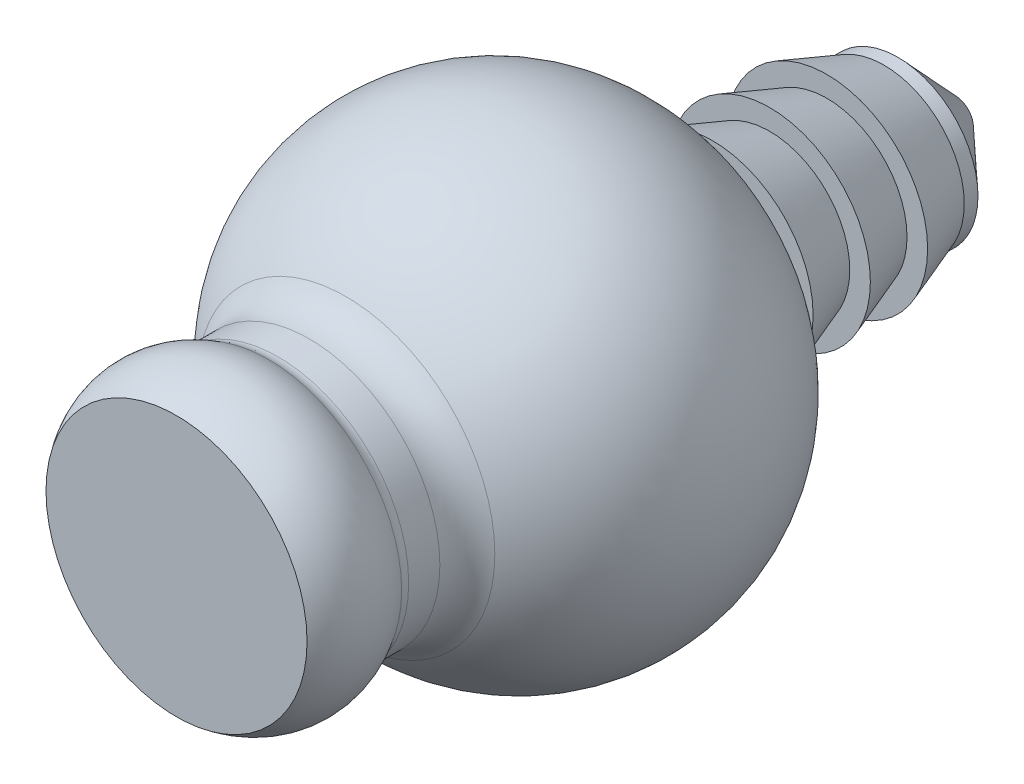
ISO-10303-21;
HEADER;
FILE_DESCRIPTION(('STEP AP214'),'2;1');
FILE_NAME('part.step','',(''),(''),'','','');
FILE_SCHEMA(('AUTOMOTIVE_DESIGN { 1 0 10303 214 1 1 1 1 }'));
ENDSEC;
DATA;
#1=APPLICATION_CONTEXT('core data for automotive mechanical design processes');
#2=APPLICATION_PROTOCOL_DEFINITION('international standard','automotive_design',2000,#1);
#3=PRODUCT_CONTEXT('',#1,'mechanical');
#4=PRODUCT('Part','Part','',(#3));
#5=PRODUCT_RELATED_PRODUCT_CATEGORY('part','',(#4));
#6=PRODUCT_DEFINITION_FORMATION('','',#4);
#7=PRODUCT_DEFINITION_CONTEXT('part definition',#1,'design');
#8=PRODUCT_DEFINITION('design','',#6,#7);
#9=PRODUCT_DEFINITION_SHAPE('','',#8);
#10=(LENGTH_UNIT() NAMED_UNIT(*) SI_UNIT(.MILLI.,.METRE.));
#11=(NAMED_UNIT(*) PLANE_ANGLE_UNIT() SI_UNIT($,.RADIAN.));
#12=(NAMED_UNIT(*) SI_UNIT($,.STERADIAN.) SOLID_ANGLE_UNIT());
#13=UNCERTAINTY_MEASURE_WITH_UNIT(LENGTH_MEASURE(1.E-05),#10,'distance_accuracy_value','');
#14=(GEOMETRIC_REPRESENTATION_CONTEXT(3) GLOBAL_UNCERTAINTY_ASSIGNED_CONTEXT((#13)) GLOBAL_UNIT_ASSIGNED_CONTEXT((#10,
#11,#12)) REPRESENTATION_CONTEXT('',''));
#15=CARTESIAN_POINT('',(0.,0.,0.));
#16=DIRECTION('',(0.,0.,1.));
#17=DIRECTION('',(1.,0.,0.));
#18=AXIS2_PLACEMENT_3D('',#15,#16,#17);
#19=CARTESIAN_POINT('',(-2.85,0.,10.7));
#20=DIRECTION('',(0.,0.,-1.));
#21=DIRECTION('',(-1.,0.,0.));
#22=AXIS2_PLACEMENT_3D('',#19,#20,#21);
#23=PLANE('',#22);
#24=CARTESIAN_POINT('',(0.,0.,10.7));
#25=DIRECTION('',(0.,0.,1.));
#26=DIRECTION('',(1.,0.,0.));
#27=AXIS2_PLACEMENT_3D('',#24,#25,#26);
#28=CIRCLE('',#27,2.85);
#29=CARTESIAN_POINT('',(2.85,0.,10.7));
#30=VERTEX_POINT('',#29);
#31=EDGE_CURVE('E84',#30,#30,#28,.T.);
#32=ORIENTED_EDGE('',*,*,#31,.T.);
#33=EDGE_LOOP('',(#32));
#34=FACE_BOUND('',#33,.T.);
#35=ADVANCED_FACE('F32',(#34),#23,.F.);
#36=CARTESIAN_POINT('',(0.,0.,-6.3));
#37=DIRECTION('',(0.,0.,1.));
#38=DIRECTION('',(1.,0.,0.));
#39=AXIS2_PLACEMENT_3D('',#36,#37,#38);
#40=PLANE('',#39);
#41=CARTESIAN_POINT('',(0.,0.,-6.3));
#42=DIRECTION('',(0.,0.,1.));
#43=DIRECTION('',(1.,0.,0.));
#44=AXIS2_PLACEMENT_3D('',#41,#42,#43);
#45=CIRCLE('',#44,0.4);
#46=CARTESIAN_POINT('',(0.4,0.,-6.3));
#47=VERTEX_POINT('',#46);
#48=EDGE_CURVE('E10',#47,#47,#45,.T.);
#49=ORIENTED_EDGE('',*,*,#48,.F.);
#50=EDGE_LOOP('',(#49));
#51=FACE_BOUND('',#50,.T.);
#52=ADVANCED_FACE('F174',(#51),#40,.F.);
#53=CARTESIAN_POINT('',(0.,0.,-6.3));
#54=DIRECTION('',(0.,0.,1.));
#55=DIRECTION('',(1.,0.,0.));
#56=AXIS2_PLACEMENT_3D('',#53,#54,#55);
#57=CONICAL_SURFACE('',#56,0.4,0.823840753418636);
#58=CARTESIAN_POINT('',(0.,0.,-5.05));
#59=DIRECTION('',(0.,0.,1.));
#60=DIRECTION('',(1.,0.,0.));
#61=AXIS2_PLACEMENT_3D('',#58,#59,#60);
#62=CIRCLE('',#61,1.75);
#63=CARTESIAN_POINT('',(1.75,0.,-5.05));
#64=VERTEX_POINT('',#63);
#65=EDGE_CURVE('E38',#64,#64,#62,.T.);
#66=CARTESIAN_POINT('',(1.75,0.,-5.05));
#67=CARTESIAN_POINT('',(1.7359375,0.,-5.06302083333333));
#68=CARTESIAN_POINT('',(1.721875,0.,-5.07604166666667));
#69=CARTESIAN_POINT('',(1.69375,0.,-5.10208333333333));
#70=CARTESIAN_POINT('',(1.6796875,0.,-5.11510416666667));
#71=CARTESIAN_POINT('',(1.6515625,0.,-5.14114583333333));
#72=CARTESIAN_POINT('',(1.6375,0.,-5.15416666666667));
#73=CARTESIAN_POINT('',(1.609375,0.,-5.18020833333333));
#74=CARTESIAN_POINT('',(1.5953125,0.,-5.19322916666667));
#75=CARTESIAN_POINT('',(1.5671875,0.,-5.21927083333333));
#76=CARTESIAN_POINT('',(1.553125,0.,-5.23229166666667));
#77=CARTESIAN_POINT('',(1.525,0.,-5.25833333333333));
#78=CARTESIAN_POINT('',(1.5109375,0.,-5.27135416666667));
#79=CARTESIAN_POINT('',(1.4828125,0.,-5.29739583333333));
#80=CARTESIAN_POINT('',(1.46875,0.,-5.31041666666667));
#81=CARTESIAN_POINT('',(1.440625,0.,-5.33645833333333));
#82=CARTESIAN_POINT('',(1.4265625,0.,-5.34947916666667));
#83=CARTESIAN_POINT('',(1.3984375,0.,-5.37552083333333));
#84=CARTESIAN_POINT('',(1.384375,0.,-5.38854166666667));
#85=CARTESIAN_POINT('',(1.35625,0.,-5.41458333333333));
#86=CARTESIAN_POINT('',(1.3421875,0.,-5.42760416666667));
#87=CARTESIAN_POINT('',(1.3140625,0.,-5.45364583333333));
#88=CARTESIAN_POINT('',(1.3,0.,-5.46666666666667));
#89=CARTESIAN_POINT('',(1.271875,0.,-5.49270833333333));
#90=CARTESIAN_POINT('',(1.2578125,0.,-5.50572916666667));
#91=CARTESIAN_POINT('',(1.2296875,0.,-5.53177083333333));
#92=CARTESIAN_POINT('',(1.215625,0.,-5.54479166666667));
#93=CARTESIAN_POINT('',(1.1875,0.,-5.57083333333333));
#94=CARTESIAN_POINT('',(1.1734375,0.,-5.58385416666667));
#95=CARTESIAN_POINT('',(1.1453125,0.,-5.60989583333333));
#96=CARTESIAN_POINT('',(1.13125,0.,-5.62291666666667));
#97=CARTESIAN_POINT('',(1.103125,0.,-5.64895833333333));
#98=CARTESIAN_POINT('',(1.0890625,0.,-5.66197916666667));
#99=CARTESIAN_POINT('',(1.0609375,0.,-5.68802083333333));
#100=CARTESIAN_POINT('',(1.046875,0.,-5.70104166666667));
#101=CARTESIAN_POINT('',(1.01875,0.,-5.72708333333333));
#102=CARTESIAN_POINT('',(1.0046875,0.,-5.74010416666667));
#103=CARTESIAN_POINT('',(0.9765625,0.,-5.76614583333333));
#104=CARTESIAN_POINT('',(0.9625,0.,-5.77916666666667));
#105=CARTESIAN_POINT('',(0.934375,0.,-5.80520833333333));
#106=CARTESIAN_POINT('',(0.9203125,0.,-5.81822916666667));
#107=CARTESIAN_POINT('',(0.8921875,0.,-5.84427083333333));
#108=CARTESIAN_POINT('',(0.878125,0.,-5.85729166666667));
#109=CARTESIAN_POINT('',(0.85,0.,-5.88333333333333));
#110=CARTESIAN_POINT('',(0.8359375,0.,-5.89635416666667));
#111=CARTESIAN_POINT('',(0.8078125,0.,-5.92239583333333));
#112=CARTESIAN_POINT('',(0.79375,0.,-5.93541666666667));
#113=CARTESIAN_POINT('',(0.765625,0.,-5.96145833333333));
#114=CARTESIAN_POINT('',(0.7515625,0.,-5.97447916666667));
#115=CARTESIAN_POINT('',(0.7234375,0.,-6.00052083333333));
#116=CARTESIAN_POINT('',(0.709375,0.,-6.01354166666667));
#117=CARTESIAN_POINT('',(0.68125,0.,-6.03958333333333));
#118=CARTESIAN_POINT('',(0.6671875,0.,-6.05260416666667));
#119=CARTESIAN_POINT('',(0.6390625,0.,-6.07864583333333));
#120=CARTESIAN_POINT('',(0.625,0.,-6.09166666666667));
#121=CARTESIAN_POINT('',(0.596874999999999,0.,-6.11770833333333));
#122=CARTESIAN_POINT('',(0.582812499999999,0.,-6.13072916666667));
#123=CARTESIAN_POINT('',(0.5546875,0.,-6.15677083333333));
#124=CARTESIAN_POINT('',(0.540625,0.,-6.16979166666667));
#125=CARTESIAN_POINT('',(0.5125,0.,-6.19583333333333));
#126=CARTESIAN_POINT('',(0.4984375,0.,-6.20885416666667));
#127=CARTESIAN_POINT('',(0.470312499999999,0.,-6.23489583333333));
#128=CARTESIAN_POINT('',(0.45625,0.,-6.24791666666667));
#129=CARTESIAN_POINT('',(0.428125,0.,-6.27395833333333));
#130=CARTESIAN_POINT('',(0.4140625,0.,-6.28697916666667));
#131=CARTESIAN_POINT('',(0.4,0.,-6.3));
#132=B_SPLINE_CURVE_WITH_KNOTS('',3,(#66,#67,#68,#69,#70,#71,#72,#73,#74,#75,#76,#77,#78,#79,
#80,#81,#82,#83,#84,#85,#86,#87,#88,#89,#90,#91,#92,#93,#94,#95,#96,#97,#98,#99,#100,#101,#102,
#103,#104,#105,#106,#107,#108,#109,#110,#111,#112,#113,#114,#115,#116,#117,#118,#119,#120,#121,
#122,#123,#124,#125,#126,#127,#128,#129,#130,#131),.UNSPECIFIED.,.F.,.F.,(4,2,2,2,2,2,2,2,2,2,2,
2,2,2,2,2,2,2,2,2,2,2,2,2,2,2,2,2,2,2,2,2,4),(0.,0.0574949046655434,0.114989809331088,
0.172484713996632,0.229979618662176,0.28747452332772,0.344969427993264,0.402464332658808,
0.459959237324352,0.517454141989896,0.57494904665544,0.632443951320984,0.689938855986528,
0.747433760652072,0.804928665317617,0.862423569983161,0.919918474648705,0.977413379314249,
1.03490828397979,1.09240318864534,1.14989809331088,1.20739299797643,1.26488790264197,
1.32238280730751,1.37987771197306,1.4373726166386,1.49486752130415,1.55236242596969,
1.60985733063523,1.66735223530078,1.72484713996632,1.78234204463187,1.83983694929741),.UNSPECIFIED.);
#133=EDGE_CURVE('BSEAM169',#64,#47,#132,.T.);
#134=ORIENTED_EDGE('',*,*,#65,.F.);
#135=ORIENTED_EDGE('',*,*,#48,.T.);
#136=ORIENTED_EDGE('',*,*,#133,.T.);
#137=ORIENTED_EDGE('',*,*,#133,.F.);
#138=EDGE_LOOP('',(#134,#136,#135,#137));
#139=FACE_BOUND('',#138,.T.);
#140=ADVANCED_FACE('F169',(#139),#57,.T.);
#141=CARTESIAN_POINT('',(0.,0.,-6.3));
#142=DIRECTION('',(0.,0.,1.));
#143=DIRECTION('',(1.,0.,0.));
#144=AXIS2_PLACEMENT_3D('',#141,#142,#143);
#145=CYLINDRICAL_SURFACE('',#144,1.75);
#146=CARTESIAN_POINT('',(0.,0.,-4.75));
#147=DIRECTION('',(0.,0.,1.));
#148=DIRECTION('',(1.,0.,0.));
#149=AXIS2_PLACEMENT_3D('',#146,#147,#148);
#150=CIRCLE('',#149,1.75);
#151=CARTESIAN_POINT('',(1.75,0.,-4.75));
#152=VERTEX_POINT('',#151);
#153=EDGE_CURVE('E42',#152,#152,#150,.T.);
#154=ORIENTED_EDGE('',*,*,#153,.F.);
#155=EDGE_LOOP('',(#154));
#156=FACE_BOUND('',#155,.T.);
#157=ORIENTED_EDGE('',*,*,#65,.T.);
#158=EDGE_LOOP('',(#157));
#159=FACE_BOUND('',#158,.T.);
#160=ADVANCED_FACE('F164',(#156,#159),#145,.T.);
#161=CARTESIAN_POINT('',(0.,0.,-4.75));
#162=DIRECTION('',(0.,0.,1.));
#163=DIRECTION('',(1.,0.,0.));
#164=AXIS2_PLACEMENT_3D('',#161,#162,#163);
#165=CONICAL_SURFACE('',#164,1.75,0.345555580581712);
#166=CARTESIAN_POINT('',(0.,0.,-3.5));
#167=DIRECTION('',(0.,0.,1.));
#168=DIRECTION('',(1.,0.,0.));
#169=AXIS2_PLACEMENT_3D('',#166,#167,#168);
#170=CIRCLE('',#169,2.2);
#171=CARTESIAN_POINT('',(2.2,0.,-3.5));
#172=VERTEX_POINT('',#171);
#173=EDGE_CURVE('E46',#172,#172,#170,.T.);
#174=ORIENTED_EDGE('',*,*,#173,.F.);
#175=EDGE_LOOP('',(#174));
#176=FACE_BOUND('',#175,.T.);
#177=ORIENTED_EDGE('',*,*,#153,.T.);
#178=EDGE_LOOP('',(#177));
#179=FACE_BOUND('',#178,.T.);
#180=ADVANCED_FACE('F158',(#176,#179),#165,.T.);
#181=CARTESIAN_POINT('',(-2.2,0.,-3.5));
#182=DIRECTION('',(0.,0.,-1.));
#183=DIRECTION('',(-1.,0.,0.));
#184=AXIS2_PLACEMENT_3D('',#181,#182,#183);
#185=PLANE('',#184);
#186=CARTESIAN_POINT('',(0.,0.,-3.5));
#187=DIRECTION('',(0.,0.,1.));
#188=DIRECTION('',(1.,0.,0.));
#189=AXIS2_PLACEMENT_3D('',#186,#187,#188);
#190=CIRCLE('',#189,1.75);
#191=CARTESIAN_POINT('',(1.75,0.,-3.5));
#192=VERTEX_POINT('',#191);
#193=EDGE_CURVE('E51',#192,#192,#190,.T.);
#194=ORIENTED_EDGE('',*,*,#193,.F.);
#195=EDGE_LOOP('',(#194));
#196=FACE_BOUND('',#195,.T.);
#197=ORIENTED_EDGE('',*,*,#173,.T.);
#198=EDGE_LOOP('',(#197));
#199=FACE_BOUND('',#198,.T.);
#200=ADVANCED_FACE('F152',(#196,#199),#185,.F.);
#201=CARTESIAN_POINT('',(0.,0.,-3.5));
#202=DIRECTION('',(0.,0.,1.));
#203=DIRECTION('',(1.,0.,0.));
#204=AXIS2_PLACEMENT_3D('',#201,#202,#203);
#205=CONICAL_SURFACE('',#204,1.75,0.345555580581712);
#206=CARTESIAN_POINT('',(0.,0.,-2.25));
#207=DIRECTION('',(0.,0.,1.));
#208=DIRECTION('',(1.,0.,0.));
#209=AXIS2_PLACEMENT_3D('',#206,#207,#208);
#210=CIRCLE('',#209,2.2);
#211=CARTESIAN_POINT('',(2.2,0.,-2.25));
#212=VERTEX_POINT('',#211);
#213=EDGE_CURVE('E54',#212,#212,#210,.T.);
#214=ORIENTED_EDGE('',*,*,#213,.F.);
#215=EDGE_LOOP('',(#214));
#216=FACE_BOUND('',#215,.T.);
#217=ORIENTED_EDGE('',*,*,#193,.T.);
#218=EDGE_LOOP('',(#217));
#219=FACE_BOUND('',#218,.T.);
#220=ADVANCED_FACE('F146',(#216,#219),#205,.T.);
#221=CARTESIAN_POINT('',(-2.2,0.,-2.25));
#222=DIRECTION('',(0.,0.,-1.));
#223=DIRECTION('',(-1.,0.,0.));
#224=AXIS2_PLACEMENT_3D('',#221,#222,#223);
#225=PLANE('',#224);
#226=CARTESIAN_POINT('',(0.,0.,-2.25));
#227=DIRECTION('',(0.,0.,1.));
#228=DIRECTION('',(1.,0.,0.));
#229=AXIS2_PLACEMENT_3D('',#226,#227,#228);
#230=CIRCLE('',#229,1.75);
#231=CARTESIAN_POINT('',(1.75,0.,-2.25));
#232=VERTEX_POINT('',#231);
#233=EDGE_CURVE('E57',#232,#232,#230,.T.);
#234=ORIENTED_EDGE('',*,*,#233,.F.);
#235=EDGE_LOOP('',(#234));
#236=FACE_BOUND('',#235,.T.);
#237=ORIENTED_EDGE('',*,*,#213,.T.);
#238=EDGE_LOOP('',(#237));
#239=FACE_BOUND('',#238,.T.);
#240=ADVANCED_FACE('F140',(#236,#239),#225,.F.);
#241=CARTESIAN_POINT('',(0.,0.,-2.25));
#242=DIRECTION('',(0.,0.,1.));
#243=DIRECTION('',(1.,0.,0.));
#244=AXIS2_PLACEMENT_3D('',#241,#242,#243);
#245=CONICAL_SURFACE('',#244,1.75,0.345555580581712);
#246=CARTESIAN_POINT('',(0.,0.,-1.));
#247=DIRECTION('',(0.,0.,1.));
#248=DIRECTION('',(1.,0.,0.));
#249=AXIS2_PLACEMENT_3D('',#246,#247,#248);
#250=CIRCLE('',#249,2.2);
#251=CARTESIAN_POINT('',(2.2,0.,-1.));
#252=VERTEX_POINT('',#251);
#253=EDGE_CURVE('E60',#252,#252,#250,.T.);
#254=ORIENTED_EDGE('',*,*,#253,.F.);
#255=EDGE_LOOP('',(#254));
#256=FACE_BOUND('',#255,.T.);
#257=ORIENTED_EDGE('',*,*,#233,.T.);
#258=EDGE_LOOP('',(#257));
#259=FACE_BOUND('',#258,.T.);
#260=ADVANCED_FACE('F134',(#256,#259),#245,.T.);
#261=CARTESIAN_POINT('',(-2.2,0.,-1.));
#262=DIRECTION('',(0.,0.,-1.));
#263=DIRECTION('',(-1.,0.,0.));
#264=AXIS2_PLACEMENT_3D('',#261,#262,#263);
#265=PLANE('',#264);
#266=CARTESIAN_POINT('',(0.,0.,-1.));
#267=DIRECTION('',(0.,0.,1.));
#268=DIRECTION('',(1.,0.,0.));
#269=AXIS2_PLACEMENT_3D('',#266,#267,#268);
#270=CIRCLE('',#269,1.75);
#271=CARTESIAN_POINT('',(1.75,0.,-1.));
#272=VERTEX_POINT('',#271);
#273=EDGE_CURVE('E63',#272,#272,#270,.T.);
#274=ORIENTED_EDGE('',*,*,#273,.F.);
#275=EDGE_LOOP('',(#274));
#276=FACE_BOUND('',#275,.T.);
#277=ORIENTED_EDGE('',*,*,#253,.T.);
#278=EDGE_LOOP('',(#277));
#279=FACE_BOUND('',#278,.T.);
#280=ADVANCED_FACE('F128',(#276,#279),#265,.F.);
#281=CARTESIAN_POINT('',(0.,0.,-6.3));
#282=DIRECTION('',(0.,0.,1.));
#283=DIRECTION('',(1.,0.,0.));
#284=AXIS2_PLACEMENT_3D('',#281,#282,#283);
#285=CYLINDRICAL_SURFACE('',#284,1.75);
#286=CARTESIAN_POINT('',(0.,0.,0.));
#287=DIRECTION('',(0.,0.,1.));
#288=DIRECTION('',(1.,0.,0.));
#289=AXIS2_PLACEMENT_3D('',#286,#287,#288);
#290=CIRCLE('',#289,1.75);
#291=CARTESIAN_POINT('',(1.75,0.,0.));
#292=VERTEX_POINT('',#291);
#293=EDGE_CURVE('E66',#292,#292,#290,.T.);
#294=ORIENTED_EDGE('',*,*,#293,.F.);
#295=EDGE_LOOP('',(#294));
#296=FACE_BOUND('',#295,.T.);
#297=ORIENTED_EDGE('',*,*,#273,.T.);
#298=EDGE_LOOP('',(#297));
#299=FACE_BOUND('',#298,.T.);
#300=ADVANCED_FACE('F122',(#296,#299),#285,.T.);
#301=CARTESIAN_POINT('',(-1.75,0.,0.));
#302=DIRECTION('',(0.,0.,1.));
#303=DIRECTION('',(1.,0.,0.));
#304=AXIS2_PLACEMENT_3D('',#301,#302,#303);
#305=PLANE('',#304);
#306=CARTESIAN_POINT('',(0.,0.,0.));
#307=DIRECTION('',(0.,0.,1.));
#308=DIRECTION('',(1.,0.,0.));
#309=AXIS2_PLACEMENT_3D('',#306,#307,#308);
#310=CIRCLE('',#309,3.25);
#311=CARTESIAN_POINT('',(3.25,0.,0.));
#312=VERTEX_POINT('',#311);
#313=EDGE_CURVE('E69',#312,#312,#310,.T.);
#314=ORIENTED_EDGE('',*,*,#313,.F.);
#315=EDGE_LOOP('',(#314));
#316=FACE_BOUND('',#315,.T.);
#317=ORIENTED_EDGE('',*,*,#293,.T.);
#318=EDGE_LOOP('',(#317));
#319=FACE_BOUND('',#318,.T.);
#320=ADVANCED_FACE('F116',(#316,#319),#305,.F.);
#321=CARTESIAN_POINT('',(0.,0.,3.5));
#322=DIRECTION('',(0.,0.,1.));
#323=DIRECTION('',(1.,0.,0.));
#324=AXIS2_PLACEMENT_3D('',#321,#322,#323);
#325=DEGENERATE_TOROIDAL_SURFACE('',#324,0.625,4.375,.T.);
#326=CARTESIAN_POINT('',(0.,0.,7.));
#327=DIRECTION('',(0.,0.,1.));
#328=DIRECTION('',(1.,0.,0.));
#329=AXIS2_PLACEMENT_3D('',#326,#327,#328);
#330=CIRCLE('',#329,3.25);
#331=CARTESIAN_POINT('',(3.25,0.,7.));
#332=VERTEX_POINT('',#331);
#333=EDGE_CURVE('E72',#332,#332,#330,.T.);
#334=ORIENTED_EDGE('',*,*,#333,.F.);
#335=EDGE_LOOP('',(#334));
#336=FACE_BOUND('',#335,.T.);
#337=ORIENTED_EDGE('',*,*,#313,.T.);
#338=EDGE_LOOP('',(#337));
#339=FACE_BOUND('',#338,.T.);
#340=ADVANCED_FACE('F110',(#336,#339),#325,.T.);
#341=CARTESIAN_POINT('',(0.,0.,7.8));
#342=DIRECTION('',(0.,0.,1.));
#343=DIRECTION('',(1.,0.,0.));
#344=AXIS2_PLACEMENT_3D('',#341,#342,#343);
#345=TOROIDAL_SURFACE('',#344,3.85,0.999999999999997);
#346=CARTESIAN_POINT('',(0.,0.,7.8));
#347=DIRECTION('',(0.,0.,1.));
#348=DIRECTION('',(1.,0.,0.));
#349=AXIS2_PLACEMENT_3D('',#346,#347,#348);
#350=CIRCLE('',#349,2.85);
#351=CARTESIAN_POINT('',(2.85,0.,7.8));
#352=VERTEX_POINT('',#351);
#353=EDGE_CURVE('E75',#352,#352,#350,.T.);
#354=ORIENTED_EDGE('',*,*,#353,.F.);
#355=EDGE_LOOP('',(#354));
#356=FACE_BOUND('',#355,.T.);
#357=ORIENTED_EDGE('',*,*,#333,.T.);
#358=EDGE_LOOP('',(#357));
#359=FACE_BOUND('',#358,.T.);
#360=ADVANCED_FACE('F104',(#356,#359),#345,.F.);
#361=CARTESIAN_POINT('',(0.,0.,-6.3));
#362=DIRECTION('',(0.,0.,1.));
#363=DIRECTION('',(1.,0.,0.));
#364=AXIS2_PLACEMENT_3D('',#361,#362,#363);
#365=CYLINDRICAL_SURFACE('',#364,2.85);
#366=CARTESIAN_POINT('',(0.,0.,8.48076396964289));
#367=DIRECTION('',(0.,0.,1.));
#368=DIRECTION('',(1.,0.,0.));
#369=AXIS2_PLACEMENT_3D('',#366,#367,#368);
#370=CIRCLE('',#369,2.85);
#371=CARTESIAN_POINT('',(2.85,0.,8.48076396964289));
#372=VERTEX_POINT('',#371);
#373=EDGE_CURVE('E78',#372,#372,#370,.T.);
#374=ORIENTED_EDGE('',*,*,#373,.F.);
#375=EDGE_LOOP('',(#374));
#376=FACE_BOUND('',#375,.T.);
#377=ORIENTED_EDGE('',*,*,#353,.T.);
#378=EDGE_LOOP('',(#377));
#379=FACE_BOUND('',#378,.T.);
#380=ADVANCED_FACE('F98',(#376,#379),#365,.T.);
#381=CARTESIAN_POINT('',(0.,0.,8.48076396964289));
#382=DIRECTION('',(0.,0.,1.));
#383=DIRECTION('',(1.,0.,0.));
#384=AXIS2_PLACEMENT_3D('',#381,#382,#383);
#385=TOROIDAL_SURFACE('',#384,3.25,0.4);
#386=CARTESIAN_POINT('',(0.,0.,8.7));
#387=DIRECTION('',(0.,0.,1.));
#388=DIRECTION('',(1.,0.,0.));
#389=AXIS2_PLACEMENT_3D('',#386,#387,#388);
#390=CIRCLE('',#389,2.91543227442974);
#391=CARTESIAN_POINT('',(2.91543227442974,0.,8.7));
#392=VERTEX_POINT('',#391);
#393=EDGE_CURVE('E81',#392,#392,#390,.T.);
#394=ORIENTED_EDGE('',*,*,#393,.F.);
#395=EDGE_LOOP('',(#394));
#396=FACE_BOUND('',#395,.T.);
#397=ORIENTED_EDGE('',*,*,#373,.T.);
#398=EDGE_LOOP('',(#397));
#399=FACE_BOUND('',#398,.T.);
#400=ADVANCED_FACE('F92',(#396,#399),#385,.F.);
#401=CARTESIAN_POINT('',(0.,0.,9.65346675727689));
#402=DIRECTION('',(0.,0.,1.));
#403=DIRECTION('',(1.,0.,0.));
#404=AXIS2_PLACEMENT_3D('',#401,#402,#403);
#405=DEGENERATE_TOROIDAL_SURFACE('',#404,1.46038310267922,1.73961689732078,.T.);
#406=ORIENTED_EDGE('',*,*,#31,.F.);
#407=EDGE_LOOP('',(#406));
#408=FACE_BOUND('',#407,.T.);
#409=ORIENTED_EDGE('',*,*,#393,.T.);
#410=EDGE_LOOP('',(#409));
#411=FACE_BOUND('',#410,.T.);
#412=ADVANCED_FACE('F89',(#408,#411),#405,.T.);
#413=CLOSED_SHELL('',(#35,#52,#140,#160,#180,#200,#220,#240,#260,#280,#300,#320,#340,#360,#380,
#400,#412));
#414=MANIFOLD_SOLID_BREP('B2',#413);
#415=ADVANCED_BREP_SHAPE_REPRESENTATION('',(#18,#414),#14);
#416=SHAPE_DEFINITION_REPRESENTATION(#9,#415);
ENDSEC;
END-ISO-10303-21;
